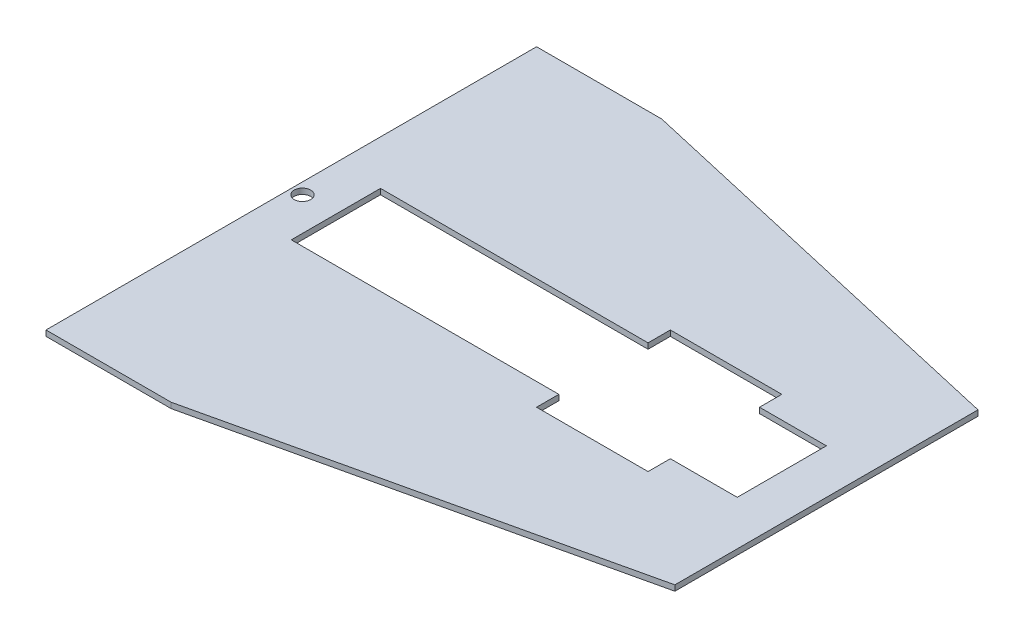
ISO-10303-21;
HEADER;
FILE_DESCRIPTION(('STEP AP214'),'2;1');
FILE_NAME('part.step','',(''),(''),'','','');
FILE_SCHEMA(('AUTOMOTIVE_DESIGN { 1 0 10303 214 1 1 1 1 }'));
ENDSEC;
DATA;
#1=APPLICATION_CONTEXT('core data for automotive mechanical design processes');
#2=APPLICATION_PROTOCOL_DEFINITION('international standard','automotive_design',2000,#1);
#3=PRODUCT_CONTEXT('',#1,'mechanical');
#4=PRODUCT('Part','Part','',(#3));
#5=PRODUCT_RELATED_PRODUCT_CATEGORY('part','',(#4));
#6=PRODUCT_DEFINITION_FORMATION('','',#4);
#7=PRODUCT_DEFINITION_CONTEXT('part definition',#1,'design');
#8=PRODUCT_DEFINITION('design','',#6,#7);
#9=PRODUCT_DEFINITION_SHAPE('','',#8);
#10=(LENGTH_UNIT() NAMED_UNIT(*) SI_UNIT(.MILLI.,.METRE.));
#11=(NAMED_UNIT(*) PLANE_ANGLE_UNIT() SI_UNIT($,.RADIAN.));
#12=(NAMED_UNIT(*) SI_UNIT($,.STERADIAN.) SOLID_ANGLE_UNIT());
#13=UNCERTAINTY_MEASURE_WITH_UNIT(LENGTH_MEASURE(1.E-05),#10,'distance_accuracy_value','');
#14=(GEOMETRIC_REPRESENTATION_CONTEXT(3) GLOBAL_UNCERTAINTY_ASSIGNED_CONTEXT((#13)) GLOBAL_UNIT_ASSIGNED_CONTEXT((#10,
#11,#12)) REPRESENTATION_CONTEXT('',''));
#15=CARTESIAN_POINT('',(0.,0.,0.));
#16=DIRECTION('',(0.,0.,1.));
#17=DIRECTION('',(1.,0.,0.));
#18=AXIS2_PLACEMENT_3D('',#15,#16,#17);
#19=CARTESIAN_POINT('',(0.,3.175,0.));
#20=DIRECTION('',(0.,-1.,0.));
#21=DIRECTION('',(0.,0.,-1.));
#22=AXIS2_PLACEMENT_3D('',#19,#20,#21);
#23=PLANE('',#22);
#24=CARTESIAN_POINT('',(6.35,3.175,139.7));
#25=DIRECTION('',(0.,1.,0.));
#26=DIRECTION('',(0.,0.,1.));
#27=AXIS2_PLACEMENT_3D('',#24,#25,#26);
#28=CIRCLE('',#27,4.699);
#29=CARTESIAN_POINT('',(6.35,3.175,144.399));
#30=VERTEX_POINT('',#29);
#31=EDGE_CURVE('E250',#30,#30,#28,.T.);
#32=ORIENTED_EDGE('',*,*,#31,.F.);
#33=EDGE_LOOP('',(#32));
#34=FACE_BOUND('',#33,.T.);
#35=DIRECTION('',(0.,0.,1.));
#36=VECTOR('',#35,1.);
#37=CARTESIAN_POINT('',(0.,3.175,279.4));
#38=LINE('',#37,#36);
#39=CARTESIAN_POINT('',(0.,3.175,0.));
#40=VERTEX_POINT('',#39);
#41=CARTESIAN_POINT('',(0.,3.175,279.4));
#42=VERTEX_POINT('',#41);
#43=EDGE_CURVE('E256',#40,#42,#38,.T.);
#44=ORIENTED_EDGE('',*,*,#43,.T.);
#45=DIRECTION('',(1.,0.,0.));
#46=VECTOR('',#45,1.);
#47=CARTESIAN_POINT('',(0.,3.175,279.4));
#48=LINE('',#47,#46);
#49=CARTESIAN_POINT('',(71.2829507535879,3.175,279.4));
#50=VERTEX_POINT('',#49);
#51=EDGE_CURVE('E259',#42,#50,#48,.T.);
#52=ORIENTED_EDGE('',*,*,#51,.T.);
#53=DIRECTION('',(0.974858506557391,0.,-0.222824801565473));
#54=VECTOR('',#53,1.);
#55=CARTESIAN_POINT('',(71.2829507535879,3.175,279.4));
#56=LINE('',#55,#54);
#57=CARTESIAN_POINT('',(304.8,3.175,226.024674442));
#58=VERTEX_POINT('',#57);
#59=EDGE_CURVE('E262',#50,#58,#56,.T.);
#60=ORIENTED_EDGE('',*,*,#59,.T.);
#61=DIRECTION('',(0.,0.,-1.));
#62=VECTOR('',#61,1.);
#63=CARTESIAN_POINT('',(304.8,3.175,53.375325558));
#64=LINE('',#63,#62);
#65=CARTESIAN_POINT('',(304.8,3.175,53.375325558));
#66=VERTEX_POINT('',#65);
#67=EDGE_CURVE('E264',#58,#66,#64,.T.);
#68=ORIENTED_EDGE('',*,*,#67,.T.);
#69=DIRECTION('',(-0.974858506557391,0.,-0.222824801565473));
#70=VECTOR('',#69,1.);
#71=CARTESIAN_POINT('',(71.2829507535879,3.175,0.));
#72=LINE('',#71,#70);
#73=CARTESIAN_POINT('',(71.2829507535879,3.175,0.));
#74=VERTEX_POINT('',#73);
#75=EDGE_CURVE('E266',#66,#74,#72,.T.);
#76=ORIENTED_EDGE('',*,*,#75,.T.);
#77=DIRECTION('',(-1.,0.,0.));
#78=VECTOR('',#77,1.);
#79=CARTESIAN_POINT('',(0.,3.175,0.));
#80=LINE('',#79,#78);
#81=EDGE_CURVE('E268',#74,#40,#80,.T.);
#82=ORIENTED_EDGE('',*,*,#81,.T.);
#83=EDGE_LOOP('',(#44,#52,#60,#68,#76,#82));
#84=FACE_BOUND('',#83,.T.);
#85=DIRECTION('',(-1.,0.,0.));
#86=VECTOR('',#85,1.);
#87=CARTESIAN_POINT('',(241.3,3.175,114.3));
#88=LINE('',#87,#86);
#89=CARTESIAN_POINT('',(279.4,3.175,114.3));
#90=VERTEX_POINT('',#89);
#91=CARTESIAN_POINT('',(241.3,3.175,114.3));
#92=VERTEX_POINT('',#91);
#93=EDGE_CURVE('E157',#90,#92,#88,.T.);
#94=ORIENTED_EDGE('',*,*,#93,.F.);
#95=DIRECTION('',(0.,0.,-1.));
#96=VECTOR('',#95,1.);
#97=CARTESIAN_POINT('',(279.4,3.175,165.1));
#98=LINE('',#97,#96);
#99=CARTESIAN_POINT('',(279.4,3.175,165.1));
#100=VERTEX_POINT('',#99);
#101=EDGE_CURVE('E198',#100,#90,#98,.T.);
#102=ORIENTED_EDGE('',*,*,#101,.F.);
#103=DIRECTION('',(1.,0.,0.));
#104=VECTOR('',#103,1.);
#105=CARTESIAN_POINT('',(241.3,3.175,165.1));
#106=LINE('',#105,#104);
#107=CARTESIAN_POINT('',(241.3,3.175,165.1));
#108=VERTEX_POINT('',#107);
#109=EDGE_CURVE('E196',#108,#100,#106,.T.);
#110=ORIENTED_EDGE('',*,*,#109,.F.);
#111=DIRECTION('',(0.,0.,-1.));
#112=VECTOR('',#111,1.);
#113=CARTESIAN_POINT('',(241.3,3.175,165.1));
#114=LINE('',#113,#112);
#115=CARTESIAN_POINT('',(241.3,3.175,177.8));
#116=VERTEX_POINT('',#115);
#117=EDGE_CURVE('E194',#116,#108,#114,.T.);
#118=ORIENTED_EDGE('',*,*,#117,.F.);
#119=DIRECTION('',(1.,0.,0.));
#120=VECTOR('',#119,1.);
#121=CARTESIAN_POINT('',(241.3,3.175,177.8));
#122=LINE('',#121,#120);
#123=CARTESIAN_POINT('',(177.8,3.175,177.8));
#124=VERTEX_POINT('',#123);
#125=EDGE_CURVE('E192',#124,#116,#122,.T.);
#126=ORIENTED_EDGE('',*,*,#125,.F.);
#127=DIRECTION('',(0.,0.,1.));
#128=VECTOR('',#127,1.);
#129=CARTESIAN_POINT('',(177.8,3.175,177.8));
#130=LINE('',#129,#128);
#131=CARTESIAN_POINT('',(177.8,3.175,165.1));
#132=VERTEX_POINT('',#131);
#133=EDGE_CURVE('E190',#132,#124,#130,.T.);
#134=ORIENTED_EDGE('',*,*,#133,.F.);
#135=DIRECTION('',(1.,0.,0.));
#136=VECTOR('',#135,1.);
#137=CARTESIAN_POINT('',(25.4,3.175,165.1));
#138=LINE('',#137,#136);
#139=CARTESIAN_POINT('',(25.4,3.175,165.1));
#140=VERTEX_POINT('',#139);
#141=EDGE_CURVE('E188',#140,#132,#138,.T.);
#142=ORIENTED_EDGE('',*,*,#141,.F.);
#143=DIRECTION('',(0.,0.,1.));
#144=VECTOR('',#143,1.);
#145=CARTESIAN_POINT('',(25.4,3.175,165.1));
#146=LINE('',#145,#144);
#147=CARTESIAN_POINT('',(25.4,3.175,114.3));
#148=VERTEX_POINT('',#147);
#149=EDGE_CURVE('E186',#148,#140,#146,.T.);
#150=ORIENTED_EDGE('',*,*,#149,.F.);
#151=DIRECTION('',(-1.,0.,0.));
#152=VECTOR('',#151,1.);
#153=CARTESIAN_POINT('',(25.4,3.175,114.3));
#154=LINE('',#153,#152);
#155=CARTESIAN_POINT('',(177.8,3.175,114.3));
#156=VERTEX_POINT('',#155);
#157=EDGE_CURVE('E184',#156,#148,#154,.T.);
#158=ORIENTED_EDGE('',*,*,#157,.F.);
#159=DIRECTION('',(0.,0.,1.));
#160=VECTOR('',#159,1.);
#161=CARTESIAN_POINT('',(177.8,3.175,101.6));
#162=LINE('',#161,#160);
#163=CARTESIAN_POINT('',(177.8,3.175,101.6));
#164=VERTEX_POINT('',#163);
#165=EDGE_CURVE('E180',#164,#156,#162,.T.);
#166=ORIENTED_EDGE('',*,*,#165,.F.);
#167=DIRECTION('',(-1.,0.,0.));
#168=VECTOR('',#167,1.);
#169=CARTESIAN_POINT('',(241.3,3.175,101.6));
#170=LINE('',#169,#168);
#171=CARTESIAN_POINT('',(241.3,3.175,101.6));
#172=VERTEX_POINT('',#171);
#173=EDGE_CURVE('E178',#172,#164,#170,.T.);
#174=ORIENTED_EDGE('',*,*,#173,.F.);
#175=DIRECTION('',(0.,0.,-1.));
#176=VECTOR('',#175,1.);
#177=CARTESIAN_POINT('',(241.3,3.175,114.3));
#178=LINE('',#177,#176);
#179=EDGE_CURVE('E165',#92,#172,#178,.T.);
#180=ORIENTED_EDGE('',*,*,#179,.F.);
#181=EDGE_LOOP('',(#94,#102,#110,#118,#126,#134,#142,#150,#158,#166,#174,#180));
#182=FACE_BOUND('',#181,.T.);
#183=ADVANCED_FACE('F32',(#34,#84,#182),#23,.F.);
#184=CARTESIAN_POINT('',(0.,0.,0.));
#185=DIRECTION('',(0.,-1.,0.));
#186=DIRECTION('',(0.,0.,-1.));
#187=AXIS2_PLACEMENT_3D('',#184,#185,#186);
#188=PLANE('',#187);
#189=DIRECTION('',(0.,0.,1.));
#190=VECTOR('',#189,1.);
#191=CARTESIAN_POINT('',(0.,0.,279.4));
#192=LINE('',#191,#190);
#193=CARTESIAN_POINT('',(0.,0.,0.));
#194=VERTEX_POINT('',#193);
#195=CARTESIAN_POINT('',(0.,0.,279.4));
#196=VERTEX_POINT('',#195);
#197=EDGE_CURVE('E253',#194,#196,#192,.T.);
#198=ORIENTED_EDGE('',*,*,#197,.F.);
#199=DIRECTION('',(-1.,0.,0.));
#200=VECTOR('',#199,1.);
#201=CARTESIAN_POINT('',(0.,0.,0.));
#202=LINE('',#201,#200);
#203=CARTESIAN_POINT('',(71.2829507535879,0.,0.));
#204=VERTEX_POINT('',#203);
#205=EDGE_CURVE('E260',#204,#194,#202,.T.);
#206=ORIENTED_EDGE('',*,*,#205,.F.);
#207=DIRECTION('',(-0.974858506557391,0.,-0.222824801565473));
#208=VECTOR('',#207,1.);
#209=CARTESIAN_POINT('',(71.2829507535879,0.,0.));
#210=LINE('',#209,#208);
#211=CARTESIAN_POINT('',(304.8,0.,53.375325558));
#212=VERTEX_POINT('',#211);
#213=EDGE_CURVE('E279',#212,#204,#210,.T.);
#214=ORIENTED_EDGE('',*,*,#213,.F.);
#215=DIRECTION('',(0.,0.,-1.));
#216=VECTOR('',#215,1.);
#217=CARTESIAN_POINT('',(304.8,0.,53.375325558));
#218=LINE('',#217,#216);
#219=CARTESIAN_POINT('',(304.8,0.,226.024674442));
#220=VERTEX_POINT('',#219);
#221=EDGE_CURVE('E277',#220,#212,#218,.T.);
#222=ORIENTED_EDGE('',*,*,#221,.F.);
#223=DIRECTION('',(0.974858506557391,0.,-0.222824801565473));
#224=VECTOR('',#223,1.);
#225=CARTESIAN_POINT('',(71.2829507535879,0.,279.4));
#226=LINE('',#225,#224);
#227=CARTESIAN_POINT('',(71.2829507535879,0.,279.4));
#228=VERTEX_POINT('',#227);
#229=EDGE_CURVE('E275',#228,#220,#226,.T.);
#230=ORIENTED_EDGE('',*,*,#229,.F.);
#231=DIRECTION('',(1.,0.,0.));
#232=VECTOR('',#231,1.);
#233=CARTESIAN_POINT('',(0.,0.,279.4));
#234=LINE('',#233,#232);
#235=EDGE_CURVE('E273',#196,#228,#234,.T.);
#236=ORIENTED_EDGE('',*,*,#235,.F.);
#237=EDGE_LOOP('',(#198,#206,#214,#222,#230,#236));
#238=FACE_BOUND('',#237,.T.);
#239=CARTESIAN_POINT('',(6.35,0.,139.7));
#240=DIRECTION('',(0.,1.,0.));
#241=DIRECTION('',(0.,0.,1.));
#242=AXIS2_PLACEMENT_3D('',#239,#240,#241);
#243=CIRCLE('',#242,4.699);
#244=CARTESIAN_POINT('',(6.35,0.,144.399));
#245=VERTEX_POINT('',#244);
#246=EDGE_CURVE('E173',#245,#245,#243,.T.);
#247=ORIENTED_EDGE('',*,*,#246,.T.);
#248=EDGE_LOOP('',(#247));
#249=FACE_BOUND('',#248,.T.);
#250=DIRECTION('',(0.,0.,-1.));
#251=VECTOR('',#250,1.);
#252=CARTESIAN_POINT('',(279.4,0.,165.1));
#253=LINE('',#252,#251);
#254=CARTESIAN_POINT('',(279.4,0.,165.1));
#255=VERTEX_POINT('',#254);
#256=CARTESIAN_POINT('',(279.4,0.,114.3));
#257=VERTEX_POINT('',#256);
#258=EDGE_CURVE('E166',#255,#257,#253,.T.);
#259=ORIENTED_EDGE('',*,*,#258,.T.);
#260=DIRECTION('',(-1.,0.,0.));
#261=VECTOR('',#260,1.);
#262=CARTESIAN_POINT('',(241.3,0.,114.3));
#263=LINE('',#262,#261);
#264=CARTESIAN_POINT('',(241.3,0.,114.3));
#265=VERTEX_POINT('',#264);
#266=EDGE_CURVE('E55',#257,#265,#263,.T.);
#267=ORIENTED_EDGE('',*,*,#266,.T.);
#268=DIRECTION('',(0.,0.,-1.));
#269=VECTOR('',#268,1.);
#270=CARTESIAN_POINT('',(241.3,0.,114.3));
#271=LINE('',#270,#269);
#272=CARTESIAN_POINT('',(241.3,0.,101.6));
#273=VERTEX_POINT('',#272);
#274=EDGE_CURVE('E172',#265,#273,#271,.T.);
#275=ORIENTED_EDGE('',*,*,#274,.T.);
#276=DIRECTION('',(-1.,0.,0.));
#277=VECTOR('',#276,1.);
#278=CARTESIAN_POINT('',(241.3,0.,101.6));
#279=LINE('',#278,#277);
#280=CARTESIAN_POINT('',(177.8,0.,101.6));
#281=VERTEX_POINT('',#280);
#282=EDGE_CURVE('E202',#273,#281,#279,.T.);
#283=ORIENTED_EDGE('',*,*,#282,.T.);
#284=DIRECTION('',(0.,0.,1.));
#285=VECTOR('',#284,1.);
#286=CARTESIAN_POINT('',(177.8,0.,101.6));
#287=LINE('',#286,#285);
#288=CARTESIAN_POINT('',(177.8,0.,114.3));
#289=VERTEX_POINT('',#288);
#290=EDGE_CURVE('E205',#281,#289,#287,.T.);
#291=ORIENTED_EDGE('',*,*,#290,.T.);
#292=DIRECTION('',(-1.,0.,0.));
#293=VECTOR('',#292,1.);
#294=CARTESIAN_POINT('',(25.4,0.,114.3));
#295=LINE('',#294,#293);
#296=CARTESIAN_POINT('',(25.4,0.,114.3));
#297=VERTEX_POINT('',#296);
#298=EDGE_CURVE('E208',#289,#297,#295,.T.);
#299=ORIENTED_EDGE('',*,*,#298,.T.);
#300=DIRECTION('',(0.,0.,1.));
#301=VECTOR('',#300,1.);
#302=CARTESIAN_POINT('',(25.4,0.,165.1));
#303=LINE('',#302,#301);
#304=CARTESIAN_POINT('',(25.4,0.,165.1));
#305=VERTEX_POINT('',#304);
#306=EDGE_CURVE('E211',#297,#305,#303,.T.);
#307=ORIENTED_EDGE('',*,*,#306,.T.);
#308=DIRECTION('',(1.,0.,0.));
#309=VECTOR('',#308,1.);
#310=CARTESIAN_POINT('',(25.4,0.,165.1));
#311=LINE('',#310,#309);
#312=CARTESIAN_POINT('',(177.8,0.,165.1));
#313=VERTEX_POINT('',#312);
#314=EDGE_CURVE('E214',#305,#313,#311,.T.);
#315=ORIENTED_EDGE('',*,*,#314,.T.);
#316=DIRECTION('',(0.,0.,1.));
#317=VECTOR('',#316,1.);
#318=CARTESIAN_POINT('',(177.8,0.,177.8));
#319=LINE('',#318,#317);
#320=CARTESIAN_POINT('',(177.8,0.,177.8));
#321=VERTEX_POINT('',#320);
#322=EDGE_CURVE('E217',#313,#321,#319,.T.);
#323=ORIENTED_EDGE('',*,*,#322,.T.);
#324=DIRECTION('',(1.,0.,0.));
#325=VECTOR('',#324,1.);
#326=CARTESIAN_POINT('',(241.3,0.,177.8));
#327=LINE('',#326,#325);
#328=CARTESIAN_POINT('',(241.3,0.,177.8));
#329=VERTEX_POINT('',#328);
#330=EDGE_CURVE('E220',#321,#329,#327,.T.);
#331=ORIENTED_EDGE('',*,*,#330,.T.);
#332=DIRECTION('',(0.,0.,-1.));
#333=VECTOR('',#332,1.);
#334=CARTESIAN_POINT('',(241.3,0.,165.1));
#335=LINE('',#334,#333);
#336=CARTESIAN_POINT('',(241.3,0.,165.1));
#337=VERTEX_POINT('',#336);
#338=EDGE_CURVE('E223',#329,#337,#335,.T.);
#339=ORIENTED_EDGE('',*,*,#338,.T.);
#340=DIRECTION('',(1.,0.,0.));
#341=VECTOR('',#340,1.);
#342=CARTESIAN_POINT('',(241.3,0.,165.1));
#343=LINE('',#342,#341);
#344=EDGE_CURVE('E226',#337,#255,#343,.T.);
#345=ORIENTED_EDGE('',*,*,#344,.T.);
#346=EDGE_LOOP('',(#259,#267,#275,#283,#291,#299,#307,#315,#323,#331,#339,#345));
#347=FACE_BOUND('',#346,.T.);
#348=ADVANCED_FACE('F303',(#238,#249,#347),#188,.T.);
#349=CARTESIAN_POINT('',(0.,3.175,279.4));
#350=DIRECTION('',(1.,0.,0.));
#351=DIRECTION('',(0.,0.,-1.));
#352=AXIS2_PLACEMENT_3D('',#349,#350,#351);
#353=PLANE('',#352);
#354=ORIENTED_EDGE('',*,*,#197,.T.);
#355=DIRECTION('',(0.,-1.,0.));
#356=VECTOR('',#355,1.);
#357=CARTESIAN_POINT('',(0.,3.175,279.4));
#358=LINE('',#357,#356);
#359=EDGE_CURVE('E11',#42,#196,#358,.T.);
#360=ORIENTED_EDGE('',*,*,#359,.F.);
#361=ORIENTED_EDGE('',*,*,#43,.F.);
#362=DIRECTION('',(0.,-1.,0.));
#363=VECTOR('',#362,1.);
#364=CARTESIAN_POINT('',(0.,3.175,0.));
#365=LINE('',#364,#363);
#366=EDGE_CURVE('E270',#40,#194,#365,.T.);
#367=ORIENTED_EDGE('',*,*,#366,.T.);
#368=EDGE_LOOP('',(#354,#360,#361,#367));
#369=FACE_BOUND('',#368,.T.);
#370=ADVANCED_FACE('F34',(#369),#353,.F.);
#371=CARTESIAN_POINT('',(0.,3.175,279.4));
#372=DIRECTION('',(0.,0.,-1.));
#373=DIRECTION('',(-1.,0.,0.));
#374=AXIS2_PLACEMENT_3D('',#371,#372,#373);
#375=PLANE('',#374);
#376=ORIENTED_EDGE('',*,*,#235,.T.);
#377=DIRECTION('',(0.,-1.,0.));
#378=VECTOR('',#377,1.);
#379=CARTESIAN_POINT('',(71.2829507535879,3.175,279.4));
#380=LINE('',#379,#378);
#381=EDGE_CURVE('E40',#50,#228,#380,.T.);
#382=ORIENTED_EDGE('',*,*,#381,.F.);
#383=ORIENTED_EDGE('',*,*,#51,.F.);
#384=ORIENTED_EDGE('',*,*,#359,.T.);
#385=EDGE_LOOP('',(#376,#382,#383,#384));
#386=FACE_BOUND('',#385,.T.);
#387=ADVANCED_FACE('F320',(#386),#375,.F.);
#388=CARTESIAN_POINT('',(71.2829507535879,3.175,279.4));
#389=DIRECTION('',(-0.222824801565473,0.,-0.974858506557391));
#390=DIRECTION('',(-0.974858506557392,0.,0.222824801565473));
#391=AXIS2_PLACEMENT_3D('',#388,#389,#390);
#392=PLANE('',#391);
#393=ORIENTED_EDGE('',*,*,#229,.T.);
#394=DIRECTION('',(0.,-1.,0.));
#395=VECTOR('',#394,1.);
#396=CARTESIAN_POINT('',(304.8,3.175,226.024674442));
#397=LINE('',#396,#395);
#398=EDGE_CURVE('E290',#58,#220,#397,.T.);
#399=ORIENTED_EDGE('',*,*,#398,.F.);
#400=ORIENTED_EDGE('',*,*,#59,.F.);
#401=ORIENTED_EDGE('',*,*,#381,.T.);
#402=EDGE_LOOP('',(#393,#399,#400,#401));
#403=FACE_BOUND('',#402,.T.);
#404=ADVANCED_FACE('F297',(#403),#392,.F.);
#405=CARTESIAN_POINT('',(304.8,3.175,53.375325558));
#406=DIRECTION('',(-1.,0.,0.));
#407=DIRECTION('',(0.,0.,1.));
#408=AXIS2_PLACEMENT_3D('',#405,#406,#407);
#409=PLANE('',#408);
#410=ORIENTED_EDGE('',*,*,#221,.T.);
#411=DIRECTION('',(0.,-1.,0.));
#412=VECTOR('',#411,1.);
#413=CARTESIAN_POINT('',(304.8,3.175,53.375325558));
#414=LINE('',#413,#412);
#415=EDGE_CURVE('E287',#66,#212,#414,.T.);
#416=ORIENTED_EDGE('',*,*,#415,.F.);
#417=ORIENTED_EDGE('',*,*,#67,.F.);
#418=ORIENTED_EDGE('',*,*,#398,.T.);
#419=EDGE_LOOP('',(#410,#416,#417,#418));
#420=FACE_BOUND('',#419,.T.);
#421=ADVANCED_FACE('F309',(#420),#409,.F.);
#422=CARTESIAN_POINT('',(71.2829507535879,3.175,0.));
#423=DIRECTION('',(-0.222824801565473,0.,0.974858506557391));
#424=DIRECTION('',(0.974858506557392,0.,0.222824801565473));
#425=AXIS2_PLACEMENT_3D('',#422,#423,#424);
#426=PLANE('',#425);
#427=ORIENTED_EDGE('',*,*,#213,.T.);
#428=DIRECTION('',(0.,-1.,0.));
#429=VECTOR('',#428,1.);
#430=CARTESIAN_POINT('',(71.2829507535879,3.175,0.));
#431=LINE('',#430,#429);
#432=EDGE_CURVE('E284',#74,#204,#431,.T.);
#433=ORIENTED_EDGE('',*,*,#432,.F.);
#434=ORIENTED_EDGE('',*,*,#75,.F.);
#435=ORIENTED_EDGE('',*,*,#415,.T.);
#436=EDGE_LOOP('',(#427,#433,#434,#435));
#437=FACE_BOUND('',#436,.T.);
#438=ADVANCED_FACE('F313',(#437),#426,.F.);
#439=CARTESIAN_POINT('',(0.,3.175,0.));
#440=DIRECTION('',(0.,0.,1.));
#441=DIRECTION('',(1.,0.,0.));
#442=AXIS2_PLACEMENT_3D('',#439,#440,#441);
#443=PLANE('',#442);
#444=ORIENTED_EDGE('',*,*,#205,.T.);
#445=ORIENTED_EDGE('',*,*,#366,.F.);
#446=ORIENTED_EDGE('',*,*,#81,.F.);
#447=ORIENTED_EDGE('',*,*,#432,.T.);
#448=EDGE_LOOP('',(#444,#445,#446,#447));
#449=FACE_BOUND('',#448,.T.);
#450=ADVANCED_FACE('F323',(#449),#443,.F.);
#451=CARTESIAN_POINT('',(6.35,3.175,139.7));
#452=DIRECTION('',(0.,-1.,0.));
#453=DIRECTION('',(0.,0.,-1.));
#454=AXIS2_PLACEMENT_3D('',#451,#452,#453);
#455=CYLINDRICAL_SURFACE('',#454,4.699);
#456=ORIENTED_EDGE('',*,*,#31,.T.);
#457=EDGE_LOOP('',(#456));
#458=FACE_BOUND('',#457,.T.);
#459=ORIENTED_EDGE('',*,*,#246,.F.);
#460=EDGE_LOOP('',(#459));
#461=FACE_BOUND('',#460,.T.);
#462=ADVANCED_FACE('F325',(#458,#461),#455,.F.);
#463=CARTESIAN_POINT('',(241.3,3.175,114.3));
#464=DIRECTION('',(0.,0.,1.));
#465=DIRECTION('',(1.,0.,0.));
#466=AXIS2_PLACEMENT_3D('',#463,#464,#465);
#467=PLANE('',#466);
#468=ORIENTED_EDGE('',*,*,#266,.F.);
#469=DIRECTION('',(0.,-1.,0.));
#470=VECTOR('',#469,1.);
#471=CARTESIAN_POINT('',(279.4,3.175,114.3));
#472=LINE('',#471,#470);
#473=EDGE_CURVE('E161',#90,#257,#472,.T.);
#474=ORIENTED_EDGE('',*,*,#473,.F.);
#475=ORIENTED_EDGE('',*,*,#93,.T.);
#476=DIRECTION('',(0.,-1.,0.));
#477=VECTOR('',#476,1.);
#478=CARTESIAN_POINT('',(241.3,3.175,114.3));
#479=LINE('',#478,#477);
#480=EDGE_CURVE('E160',#92,#265,#479,.T.);
#481=ORIENTED_EDGE('',*,*,#480,.T.);
#482=EDGE_LOOP('',(#468,#474,#475,#481));
#483=FACE_BOUND('',#482,.T.);
#484=ADVANCED_FACE('F159',(#483),#467,.T.);
#485=CARTESIAN_POINT('',(241.3,3.175,114.3));
#486=DIRECTION('',(-1.,0.,0.));
#487=DIRECTION('',(0.,0.,1.));
#488=AXIS2_PLACEMENT_3D('',#485,#486,#487);
#489=PLANE('',#488);
#490=ORIENTED_EDGE('',*,*,#274,.F.);
#491=ORIENTED_EDGE('',*,*,#480,.F.);
#492=ORIENTED_EDGE('',*,*,#179,.T.);
#493=DIRECTION('',(0.,-1.,0.));
#494=VECTOR('',#493,1.);
#495=CARTESIAN_POINT('',(241.3,3.175,101.6));
#496=LINE('',#495,#494);
#497=EDGE_CURVE('E174',#172,#273,#496,.T.);
#498=ORIENTED_EDGE('',*,*,#497,.T.);
#499=EDGE_LOOP('',(#490,#491,#492,#498));
#500=FACE_BOUND('',#499,.T.);
#501=ADVANCED_FACE('F169',(#500),#489,.T.);
#502=CARTESIAN_POINT('',(241.3,3.175,101.6));
#503=DIRECTION('',(0.,0.,1.));
#504=DIRECTION('',(1.,0.,0.));
#505=AXIS2_PLACEMENT_3D('',#502,#503,#504);
#506=PLANE('',#505);
#507=ORIENTED_EDGE('',*,*,#282,.F.);
#508=ORIENTED_EDGE('',*,*,#497,.F.);
#509=ORIENTED_EDGE('',*,*,#173,.T.);
#510=DIRECTION('',(0.,-1.,0.));
#511=VECTOR('',#510,1.);
#512=CARTESIAN_POINT('',(177.8,3.175,101.6));
#513=LINE('',#512,#511);
#514=EDGE_CURVE('E247',#164,#281,#513,.T.);
#515=ORIENTED_EDGE('',*,*,#514,.T.);
#516=EDGE_LOOP('',(#507,#508,#509,#515));
#517=FACE_BOUND('',#516,.T.);
#518=ADVANCED_FACE('F347',(#517),#506,.T.);
#519=CARTESIAN_POINT('',(177.8,3.175,101.6));
#520=DIRECTION('',(1.,0.,0.));
#521=DIRECTION('',(0.,0.,-1.));
#522=AXIS2_PLACEMENT_3D('',#519,#520,#521);
#523=PLANE('',#522);
#524=ORIENTED_EDGE('',*,*,#290,.F.);
#525=ORIENTED_EDGE('',*,*,#514,.F.);
#526=ORIENTED_EDGE('',*,*,#165,.T.);
#527=DIRECTION('',(0.,-1.,0.));
#528=VECTOR('',#527,1.);
#529=CARTESIAN_POINT('',(177.8,3.175,114.3));
#530=LINE('',#529,#528);
#531=EDGE_CURVE('E245',#156,#289,#530,.T.);
#532=ORIENTED_EDGE('',*,*,#531,.T.);
#533=EDGE_LOOP('',(#524,#525,#526,#532));
#534=FACE_BOUND('',#533,.T.);
#535=ADVANCED_FACE('F350',(#534),#523,.T.);
#536=CARTESIAN_POINT('',(25.4,3.175,114.3));
#537=DIRECTION('',(0.,0.,1.));
#538=DIRECTION('',(1.,0.,0.));
#539=AXIS2_PLACEMENT_3D('',#536,#537,#538);
#540=PLANE('',#539);
#541=ORIENTED_EDGE('',*,*,#298,.F.);
#542=ORIENTED_EDGE('',*,*,#531,.F.);
#543=ORIENTED_EDGE('',*,*,#157,.T.);
#544=DIRECTION('',(0.,-1.,0.));
#545=VECTOR('',#544,1.);
#546=CARTESIAN_POINT('',(25.4,3.175,114.3));
#547=LINE('',#546,#545);
#548=EDGE_CURVE('E243',#148,#297,#547,.T.);
#549=ORIENTED_EDGE('',*,*,#548,.T.);
#550=EDGE_LOOP('',(#541,#542,#543,#549));
#551=FACE_BOUND('',#550,.T.);
#552=ADVANCED_FACE('F354',(#551),#540,.T.);
#553=CARTESIAN_POINT('',(25.4,3.175,165.1));
#554=DIRECTION('',(1.,0.,0.));
#555=DIRECTION('',(0.,0.,-1.));
#556=AXIS2_PLACEMENT_3D('',#553,#554,#555);
#557=PLANE('',#556);
#558=ORIENTED_EDGE('',*,*,#306,.F.);
#559=ORIENTED_EDGE('',*,*,#548,.F.);
#560=ORIENTED_EDGE('',*,*,#149,.T.);
#561=DIRECTION('',(0.,-1.,0.));
#562=VECTOR('',#561,1.);
#563=CARTESIAN_POINT('',(25.4,3.175,165.1));
#564=LINE('',#563,#562);
#565=EDGE_CURVE('E241',#140,#305,#564,.T.);
#566=ORIENTED_EDGE('',*,*,#565,.T.);
#567=EDGE_LOOP('',(#558,#559,#560,#566));
#568=FACE_BOUND('',#567,.T.);
#569=ADVANCED_FACE('F358',(#568),#557,.T.);
#570=CARTESIAN_POINT('',(25.4,3.175,165.1));
#571=DIRECTION('',(0.,0.,-1.));
#572=DIRECTION('',(-1.,0.,0.));
#573=AXIS2_PLACEMENT_3D('',#570,#571,#572);
#574=PLANE('',#573);
#575=ORIENTED_EDGE('',*,*,#314,.F.);
#576=ORIENTED_EDGE('',*,*,#565,.F.);
#577=ORIENTED_EDGE('',*,*,#141,.T.);
#578=DIRECTION('',(0.,-1.,0.));
#579=VECTOR('',#578,1.);
#580=CARTESIAN_POINT('',(177.8,3.175,165.1));
#581=LINE('',#580,#579);
#582=EDGE_CURVE('E239',#132,#313,#581,.T.);
#583=ORIENTED_EDGE('',*,*,#582,.T.);
#584=EDGE_LOOP('',(#575,#576,#577,#583));
#585=FACE_BOUND('',#584,.T.);
#586=ADVANCED_FACE('F362',(#585),#574,.T.);
#587=CARTESIAN_POINT('',(177.8,3.175,177.8));
#588=DIRECTION('',(1.,0.,0.));
#589=DIRECTION('',(0.,0.,-1.));
#590=AXIS2_PLACEMENT_3D('',#587,#588,#589);
#591=PLANE('',#590);
#592=ORIENTED_EDGE('',*,*,#322,.F.);
#593=ORIENTED_EDGE('',*,*,#582,.F.);
#594=ORIENTED_EDGE('',*,*,#133,.T.);
#595=DIRECTION('',(0.,-1.,0.));
#596=VECTOR('',#595,1.);
#597=CARTESIAN_POINT('',(177.8,3.175,177.8));
#598=LINE('',#597,#596);
#599=EDGE_CURVE('E237',#124,#321,#598,.T.);
#600=ORIENTED_EDGE('',*,*,#599,.T.);
#601=EDGE_LOOP('',(#592,#593,#594,#600));
#602=FACE_BOUND('',#601,.T.);
#603=ADVANCED_FACE('F366',(#602),#591,.T.);
#604=CARTESIAN_POINT('',(241.3,3.175,177.8));
#605=DIRECTION('',(0.,0.,-1.));
#606=DIRECTION('',(-1.,0.,0.));
#607=AXIS2_PLACEMENT_3D('',#604,#605,#606);
#608=PLANE('',#607);
#609=ORIENTED_EDGE('',*,*,#330,.F.);
#610=ORIENTED_EDGE('',*,*,#599,.F.);
#611=ORIENTED_EDGE('',*,*,#125,.T.);
#612=DIRECTION('',(0.,-1.,0.));
#613=VECTOR('',#612,1.);
#614=CARTESIAN_POINT('',(241.3,3.175,177.8));
#615=LINE('',#614,#613);
#616=EDGE_CURVE('E235',#116,#329,#615,.T.);
#617=ORIENTED_EDGE('',*,*,#616,.T.);
#618=EDGE_LOOP('',(#609,#610,#611,#617));
#619=FACE_BOUND('',#618,.T.);
#620=ADVANCED_FACE('F370',(#619),#608,.T.);
#621=CARTESIAN_POINT('',(241.3,3.175,165.1));
#622=DIRECTION('',(-1.,0.,0.));
#623=DIRECTION('',(0.,0.,1.));
#624=AXIS2_PLACEMENT_3D('',#621,#622,#623);
#625=PLANE('',#624);
#626=ORIENTED_EDGE('',*,*,#338,.F.);
#627=ORIENTED_EDGE('',*,*,#616,.F.);
#628=ORIENTED_EDGE('',*,*,#117,.T.);
#629=DIRECTION('',(0.,-1.,0.));
#630=VECTOR('',#629,1.);
#631=CARTESIAN_POINT('',(241.3,3.175,165.1));
#632=LINE('',#631,#630);
#633=EDGE_CURVE('E233',#108,#337,#632,.T.);
#634=ORIENTED_EDGE('',*,*,#633,.T.);
#635=EDGE_LOOP('',(#626,#627,#628,#634));
#636=FACE_BOUND('',#635,.T.);
#637=ADVANCED_FACE('F374',(#636),#625,.T.);
#638=CARTESIAN_POINT('',(241.3,3.175,165.1));
#639=DIRECTION('',(0.,0.,-1.));
#640=DIRECTION('',(-1.,0.,0.));
#641=AXIS2_PLACEMENT_3D('',#638,#639,#640);
#642=PLANE('',#641);
#643=ORIENTED_EDGE('',*,*,#344,.F.);
#644=ORIENTED_EDGE('',*,*,#633,.F.);
#645=ORIENTED_EDGE('',*,*,#109,.T.);
#646=DIRECTION('',(0.,-1.,0.));
#647=VECTOR('',#646,1.);
#648=CARTESIAN_POINT('',(279.4,3.175,165.1));
#649=LINE('',#648,#647);
#650=EDGE_CURVE('E47',#100,#255,#649,.T.);
#651=ORIENTED_EDGE('',*,*,#650,.T.);
#652=EDGE_LOOP('',(#643,#644,#645,#651));
#653=FACE_BOUND('',#652,.T.);
#654=ADVANCED_FACE('F378',(#653),#642,.T.);
#655=CARTESIAN_POINT('',(279.4,3.175,165.1));
#656=DIRECTION('',(-1.,0.,0.));
#657=DIRECTION('',(0.,0.,1.));
#658=AXIS2_PLACEMENT_3D('',#655,#656,#657);
#659=PLANE('',#658);
#660=ORIENTED_EDGE('',*,*,#258,.F.);
#661=ORIENTED_EDGE('',*,*,#650,.F.);
#662=ORIENTED_EDGE('',*,*,#101,.T.);
#663=ORIENTED_EDGE('',*,*,#473,.T.);
#664=EDGE_LOOP('',(#660,#661,#662,#663));
#665=FACE_BOUND('',#664,.T.);
#666=ADVANCED_FACE('F382',(#665),#659,.T.);
#667=CLOSED_SHELL('',(#183,#348,#370,#387,#404,#421,#438,#450,#462,#484,#501,#518,#535,#552,
#569,#586,#603,#620,#637,#654,#666));
#668=MANIFOLD_SOLID_BREP('B2',#667);
#669=ADVANCED_BREP_SHAPE_REPRESENTATION('',(#18,#668),#14);
#670=SHAPE_DEFINITION_REPRESENTATION(#9,#669);
ENDSEC;
END-ISO-10303-21;
